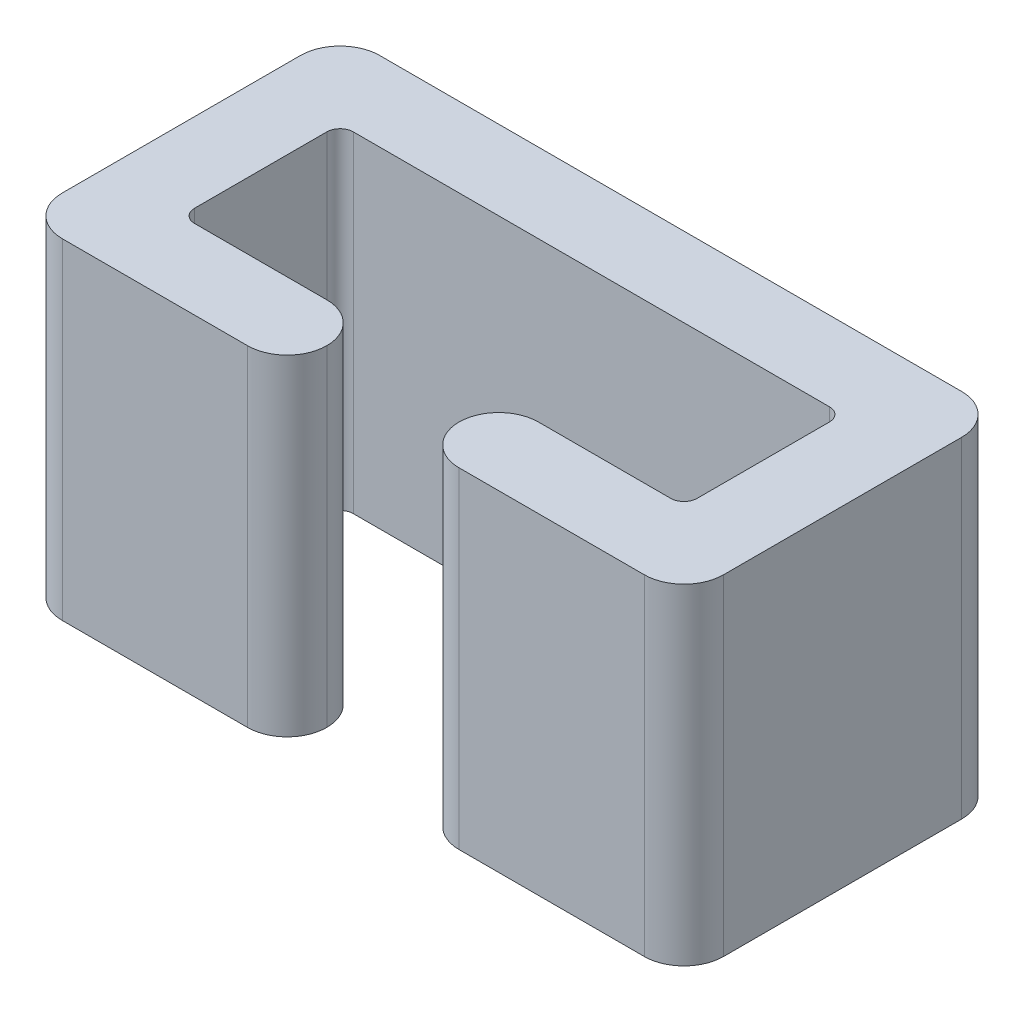
ISO-10303-21;
HEADER;
FILE_DESCRIPTION(('STEP AP214'),'2;1');
FILE_NAME('part.step','',(''),(''),'','','');
FILE_SCHEMA(('AUTOMOTIVE_DESIGN { 1 0 10303 214 1 1 1 1 }'));
ENDSEC;
DATA;
#1=APPLICATION_CONTEXT('core data for automotive mechanical design processes');
#2=APPLICATION_PROTOCOL_DEFINITION('international standard','automotive_design',2000,#1);
#3=PRODUCT_CONTEXT('',#1,'mechanical');
#4=PRODUCT('Part','Part','',(#3));
#5=PRODUCT_RELATED_PRODUCT_CATEGORY('part','',(#4));
#6=PRODUCT_DEFINITION_FORMATION('','',#4);
#7=PRODUCT_DEFINITION_CONTEXT('part definition',#1,'design');
#8=PRODUCT_DEFINITION('design','',#6,#7);
#9=PRODUCT_DEFINITION_SHAPE('','',#8);
#10=(LENGTH_UNIT() NAMED_UNIT(*) SI_UNIT(.MILLI.,.METRE.));
#11=(NAMED_UNIT(*) PLANE_ANGLE_UNIT() SI_UNIT($,.RADIAN.));
#12=(NAMED_UNIT(*) SI_UNIT($,.STERADIAN.) SOLID_ANGLE_UNIT());
#13=UNCERTAINTY_MEASURE_WITH_UNIT(LENGTH_MEASURE(1.E-05),#10,'distance_accuracy_value','');
#14=(GEOMETRIC_REPRESENTATION_CONTEXT(3) GLOBAL_UNCERTAINTY_ASSIGNED_CONTEXT((#13)) GLOBAL_UNIT_ASSIGNED_CONTEXT((#10,
#11,#12)) REPRESENTATION_CONTEXT('',''));
#15=CARTESIAN_POINT('',(0.,0.,0.));
#16=DIRECTION('',(0.,0.,1.));
#17=DIRECTION('',(1.,0.,0.));
#18=AXIS2_PLACEMENT_3D('',#15,#16,#17);
#19=CARTESIAN_POINT('',(1.,5.,4.8));
#20=DIRECTION('',(0.,0.,-1.));
#21=DIRECTION('',(-1.,0.,0.));
#22=AXIS2_PLACEMENT_3D('',#19,#20,#21);
#23=PLANE('',#22);
#24=DIRECTION('',(1.,0.,0.));
#25=VECTOR('',#24,1.);
#26=CARTESIAN_POINT('',(1.,0.,4.8));
#27=LINE('',#26,#25);
#28=CARTESIAN_POINT('',(1.6,0.,4.8));
#29=VERTEX_POINT('',#28);
#30=CARTESIAN_POINT('',(4.4,0.,4.8));
#31=VERTEX_POINT('',#30);
#32=EDGE_CURVE('E342',#29,#31,#27,.T.);
#33=ORIENTED_EDGE('',*,*,#32,.T.);
#34=DIRECTION('',(0.,-1.,0.));
#35=VECTOR('',#34,1.);
#36=CARTESIAN_POINT('',(4.4,5.,4.8));
#37=LINE('',#36,#35);
#38=CARTESIAN_POINT('',(4.4,5.,4.8));
#39=VERTEX_POINT('',#38);
#40=EDGE_CURVE('E319',#31,#39,#37,.F.);
#41=ORIENTED_EDGE('',*,*,#40,.T.);
#42=DIRECTION('',(1.,0.,0.));
#43=VECTOR('',#42,1.);
#44=CARTESIAN_POINT('',(1.,5.,4.8));
#45=LINE('',#44,#43);
#46=CARTESIAN_POINT('',(1.6,5.,4.8));
#47=VERTEX_POINT('',#46);
#48=EDGE_CURVE('E255',#47,#39,#45,.T.);
#49=ORIENTED_EDGE('',*,*,#48,.F.);
#50=DIRECTION('',(0.,-1.,0.));
#51=VECTOR('',#50,1.);
#52=CARTESIAN_POINT('',(1.6,5.,4.8));
#53=LINE('',#52,#51);
#54=EDGE_CURVE('E315',#47,#29,#53,.T.);
#55=ORIENTED_EDGE('',*,*,#54,.T.);
#56=EDGE_LOOP('',(#33,#41,#49,#55));
#57=FACE_BOUND('',#56,.T.);
#58=ADVANCED_FACE('F45',(#57),#23,.F.);
#59=CARTESIAN_POINT('',(5.,5.,4.8));
#60=DIRECTION('',(-1.,0.,0.));
#61=DIRECTION('',(0.,0.,1.));
#62=AXIS2_PLACEMENT_3D('',#59,#60,#61);
#63=PLANE('',#62);
#64=DIRECTION('',(0.,0.,-1.));
#65=VECTOR('',#64,1.);
#66=CARTESIAN_POINT('',(5.,0.,4.8));
#67=LINE('',#66,#65);
#68=CARTESIAN_POINT('',(5.,0.,4.2));
#69=VERTEX_POINT('',#68);
#70=CARTESIAN_POINT('',(5.,0.,0.6));
#71=VERTEX_POINT('',#70);
#72=EDGE_CURVE('E233',#69,#71,#67,.T.);
#73=ORIENTED_EDGE('',*,*,#72,.T.);
#74=DIRECTION('',(0.,-1.,0.));
#75=VECTOR('',#74,1.);
#76=CARTESIAN_POINT('',(5.,5.,0.6));
#77=LINE('',#76,#75);
#78=CARTESIAN_POINT('',(5.,5.,0.6));
#79=VERTEX_POINT('',#78);
#80=EDGE_CURVE('E312',#71,#79,#77,.F.);
#81=ORIENTED_EDGE('',*,*,#80,.T.);
#82=DIRECTION('',(0.,0.,-1.));
#83=VECTOR('',#82,1.);
#84=CARTESIAN_POINT('',(5.,5.,4.8));
#85=LINE('',#84,#83);
#86=CARTESIAN_POINT('',(5.,5.,4.2));
#87=VERTEX_POINT('',#86);
#88=EDGE_CURVE('E439',#87,#79,#85,.T.);
#89=ORIENTED_EDGE('',*,*,#88,.F.);
#90=DIRECTION('',(0.,-1.,0.));
#91=VECTOR('',#90,1.);
#92=CARTESIAN_POINT('',(5.,5.,4.2));
#93=LINE('',#92,#91);
#94=EDGE_CURVE('E308',#87,#69,#93,.T.);
#95=ORIENTED_EDGE('',*,*,#94,.T.);
#96=EDGE_LOOP('',(#73,#81,#89,#95));
#97=FACE_BOUND('',#96,.T.);
#98=ADVANCED_FACE('F429',(#97),#63,.F.);
#99=CARTESIAN_POINT('',(-5.,5.,0.));
#100=DIRECTION('',(0.,0.,1.));
#101=DIRECTION('',(1.,0.,0.));
#102=AXIS2_PLACEMENT_3D('',#99,#100,#101);
#103=PLANE('',#102);
#104=DIRECTION('',(-1.,0.,0.));
#105=VECTOR('',#104,1.);
#106=CARTESIAN_POINT('',(-5.,0.,0.));
#107=LINE('',#106,#105);
#108=CARTESIAN_POINT('',(4.4,0.,0.));
#109=VERTEX_POINT('',#108);
#110=CARTESIAN_POINT('',(-4.4,0.,0.));
#111=VERTEX_POINT('',#110);
#112=EDGE_CURVE('E226',#109,#111,#107,.T.);
#113=ORIENTED_EDGE('',*,*,#112,.T.);
#114=DIRECTION('',(0.,-1.,0.));
#115=VECTOR('',#114,1.);
#116=CARTESIAN_POINT('',(-4.4,5.,0.));
#117=LINE('',#116,#115);
#118=CARTESIAN_POINT('',(-4.4,5.,0.));
#119=VERTEX_POINT('',#118);
#120=EDGE_CURVE('E201',#111,#119,#117,.F.);
#121=ORIENTED_EDGE('',*,*,#120,.T.);
#122=DIRECTION('',(-1.,0.,0.));
#123=VECTOR('',#122,1.);
#124=CARTESIAN_POINT('',(-5.,5.,0.));
#125=LINE('',#124,#123);
#126=CARTESIAN_POINT('',(4.4,5.,0.));
#127=VERTEX_POINT('',#126);
#128=EDGE_CURVE('E438',#127,#119,#125,.T.);
#129=ORIENTED_EDGE('',*,*,#128,.F.);
#130=DIRECTION('',(0.,-1.,0.));
#131=VECTOR('',#130,1.);
#132=CARTESIAN_POINT('',(4.4,5.,0.));
#133=LINE('',#132,#131);
#134=EDGE_CURVE('E207',#127,#109,#133,.T.);
#135=ORIENTED_EDGE('',*,*,#134,.T.);
#136=EDGE_LOOP('',(#113,#121,#129,#135));
#137=FACE_BOUND('',#136,.T.);
#138=ADVANCED_FACE('F441',(#137),#103,.F.);
#139=CARTESIAN_POINT('',(-5.,5.,0.));
#140=DIRECTION('',(1.,0.,0.));
#141=DIRECTION('',(0.,0.,-1.));
#142=AXIS2_PLACEMENT_3D('',#139,#140,#141);
#143=PLANE('',#142);
#144=DIRECTION('',(0.,0.,1.));
#145=VECTOR('',#144,1.);
#146=CARTESIAN_POINT('',(-5.,5.,0.));
#147=LINE('',#146,#145);
#148=CARTESIAN_POINT('',(-5.,5.,0.6));
#149=VERTEX_POINT('',#148);
#150=CARTESIAN_POINT('',(-5.,5.,4.2));
#151=VERTEX_POINT('',#150);
#152=EDGE_CURVE('E217',#149,#151,#147,.T.);
#153=ORIENTED_EDGE('',*,*,#152,.F.);
#154=DIRECTION('',(0.,-1.,0.));
#155=VECTOR('',#154,1.);
#156=CARTESIAN_POINT('',(-5.,5.,0.6));
#157=LINE('',#156,#155);
#158=CARTESIAN_POINT('',(-5.,0.,0.6));
#159=VERTEX_POINT('',#158);
#160=EDGE_CURVE('E200',#149,#159,#157,.T.);
#161=ORIENTED_EDGE('',*,*,#160,.T.);
#162=DIRECTION('',(0.,0.,1.));
#163=VECTOR('',#162,1.);
#164=CARTESIAN_POINT('',(-5.,0.,0.));
#165=LINE('',#164,#163);
#166=CARTESIAN_POINT('',(-5.,0.,4.2));
#167=VERTEX_POINT('',#166);
#168=EDGE_CURVE('E214',#159,#167,#165,.T.);
#169=ORIENTED_EDGE('',*,*,#168,.T.);
#170=DIRECTION('',(0.,-1.,0.));
#171=VECTOR('',#170,1.);
#172=CARTESIAN_POINT('',(-5.,5.,4.2));
#173=LINE('',#172,#171);
#174=EDGE_CURVE('E220',#167,#151,#173,.F.);
#175=ORIENTED_EDGE('',*,*,#174,.T.);
#176=EDGE_LOOP('',(#153,#161,#169,#175));
#177=FACE_BOUND('',#176,.T.);
#178=ADVANCED_FACE('F213',(#177),#143,.F.);
#179=CARTESIAN_POINT('',(-5.,5.,4.8));
#180=DIRECTION('',(0.,0.,-1.));
#181=DIRECTION('',(-1.,0.,0.));
#182=AXIS2_PLACEMENT_3D('',#179,#180,#181);
#183=PLANE('',#182);
#184=DIRECTION('',(1.,0.,0.));
#185=VECTOR('',#184,1.);
#186=CARTESIAN_POINT('',(-5.,0.,4.8));
#187=LINE('',#186,#185);
#188=CARTESIAN_POINT('',(-4.4,0.,4.8));
#189=VERTEX_POINT('',#188);
#190=CARTESIAN_POINT('',(-1.6,0.,4.8));
#191=VERTEX_POINT('',#190);
#192=EDGE_CURVE('E225',#189,#191,#187,.T.);
#193=ORIENTED_EDGE('',*,*,#192,.T.);
#194=DIRECTION('',(0.,-1.,0.));
#195=VECTOR('',#194,1.);
#196=CARTESIAN_POINT('',(-1.6,5.,4.8));
#197=LINE('',#196,#195);
#198=CARTESIAN_POINT('',(-1.6,5.,4.8));
#199=VERTEX_POINT('',#198);
#200=EDGE_CURVE('E334',#191,#199,#197,.F.);
#201=ORIENTED_EDGE('',*,*,#200,.T.);
#202=DIRECTION('',(1.,0.,0.));
#203=VECTOR('',#202,1.);
#204=CARTESIAN_POINT('',(-5.,5.,4.8));
#205=LINE('',#204,#203);
#206=CARTESIAN_POINT('',(-4.4,5.,4.8));
#207=VERTEX_POINT('',#206);
#208=EDGE_CURVE('E446',#207,#199,#205,.T.);
#209=ORIENTED_EDGE('',*,*,#208,.F.);
#210=DIRECTION('',(0.,-1.,0.));
#211=VECTOR('',#210,1.);
#212=CARTESIAN_POINT('',(-4.4,5.,4.8));
#213=LINE('',#212,#211);
#214=EDGE_CURVE('E330',#207,#189,#213,.T.);
#215=ORIENTED_EDGE('',*,*,#214,.T.);
#216=EDGE_LOOP('',(#193,#201,#209,#215));
#217=FACE_BOUND('',#216,.T.);
#218=ADVANCED_FACE('F475',(#217),#183,.F.);
#219=CARTESIAN_POINT('',(-0.999999999999999,5.,3.6));
#220=DIRECTION('',(0.,0.,1.));
#221=DIRECTION('',(1.,0.,0.));
#222=AXIS2_PLACEMENT_3D('',#219,#220,#221);
#223=PLANE('',#222);
#224=DIRECTION('',(-1.,0.,0.));
#225=VECTOR('',#224,1.);
#226=CARTESIAN_POINT('',(-0.999999999999999,0.,3.6));
#227=LINE('',#226,#225);
#228=CARTESIAN_POINT('',(-1.6,0.,3.6));
#229=VERTEX_POINT('',#228);
#230=CARTESIAN_POINT('',(-3.6,0.,3.6));
#231=VERTEX_POINT('',#230);
#232=EDGE_CURVE('E231',#229,#231,#227,.T.);
#233=ORIENTED_EDGE('',*,*,#232,.T.);
#234=DIRECTION('',(0.,-1.,0.));
#235=VECTOR('',#234,1.);
#236=CARTESIAN_POINT('',(-3.6,5.,3.6));
#237=LINE('',#236,#235);
#238=CARTESIAN_POINT('',(-3.6,5.,3.6));
#239=VERTEX_POINT('',#238);
#240=EDGE_CURVE('E353',#231,#239,#237,.F.);
#241=ORIENTED_EDGE('',*,*,#240,.T.);
#242=DIRECTION('',(-1.,0.,0.));
#243=VECTOR('',#242,1.);
#244=CARTESIAN_POINT('',(-0.999999999999999,5.,3.6));
#245=LINE('',#244,#243);
#246=CARTESIAN_POINT('',(-1.6,5.,3.6));
#247=VERTEX_POINT('',#246);
#248=EDGE_CURVE('E416',#247,#239,#245,.T.);
#249=ORIENTED_EDGE('',*,*,#248,.F.);
#250=DIRECTION('',(0.,-1.,0.));
#251=VECTOR('',#250,1.);
#252=CARTESIAN_POINT('',(-1.6,5.,3.6));
#253=LINE('',#252,#251);
#254=EDGE_CURVE('E326',#247,#229,#253,.T.);
#255=ORIENTED_EDGE('',*,*,#254,.T.);
#256=EDGE_LOOP('',(#233,#241,#249,#255));
#257=FACE_BOUND('',#256,.T.);
#258=ADVANCED_FACE('F464',(#257),#223,.F.);
#259=CARTESIAN_POINT('',(-3.8,5.,3.6));
#260=DIRECTION('',(-1.,0.,0.));
#261=DIRECTION('',(0.,0.,1.));
#262=AXIS2_PLACEMENT_3D('',#259,#260,#261);
#263=PLANE('',#262);
#264=DIRECTION('',(0.,0.,-1.));
#265=VECTOR('',#264,1.);
#266=CARTESIAN_POINT('',(-3.8,5.,3.6));
#267=LINE('',#266,#265);
#268=CARTESIAN_POINT('',(-3.8,5.,3.4));
#269=VERTEX_POINT('',#268);
#270=CARTESIAN_POINT('',(-3.8,5.,1.4));
#271=VERTEX_POINT('',#270);
#272=EDGE_CURVE('E406',#269,#271,#267,.T.);
#273=ORIENTED_EDGE('',*,*,#272,.F.);
#274=DIRECTION('',(0.,-1.,0.));
#275=VECTOR('',#274,1.);
#276=CARTESIAN_POINT('',(-3.8,0.,3.4));
#277=LINE('',#276,#275);
#278=CARTESIAN_POINT('',(-3.8,0.,3.4));
#279=VERTEX_POINT('',#278);
#280=EDGE_CURVE('E349',#269,#279,#277,.T.);
#281=ORIENTED_EDGE('',*,*,#280,.T.);
#282=DIRECTION('',(0.,0.,-1.));
#283=VECTOR('',#282,1.);
#284=CARTESIAN_POINT('',(-3.8,0.,3.6));
#285=LINE('',#284,#283);
#286=CARTESIAN_POINT('',(-3.8,0.,1.4));
#287=VERTEX_POINT('',#286);
#288=EDGE_CURVE('E240',#279,#287,#285,.T.);
#289=ORIENTED_EDGE('',*,*,#288,.T.);
#290=DIRECTION('',(0.,-1.,0.));
#291=VECTOR('',#290,1.);
#292=CARTESIAN_POINT('',(-3.8,5.,1.4));
#293=LINE('',#292,#291);
#294=EDGE_CURVE('E337',#287,#271,#293,.F.);
#295=ORIENTED_EDGE('',*,*,#294,.T.);
#296=EDGE_LOOP('',(#273,#281,#289,#295));
#297=FACE_BOUND('',#296,.T.);
#298=ADVANCED_FACE('F396',(#297),#263,.F.);
#299=CARTESIAN_POINT('',(-3.8,5.,1.2));
#300=DIRECTION('',(0.,0.,-1.));
#301=DIRECTION('',(-1.,0.,0.));
#302=AXIS2_PLACEMENT_3D('',#299,#300,#301);
#303=PLANE('',#302);
#304=DIRECTION('',(1.,0.,0.));
#305=VECTOR('',#304,1.);
#306=CARTESIAN_POINT('',(-3.8,0.,1.2));
#307=LINE('',#306,#305);
#308=CARTESIAN_POINT('',(-3.6,0.,1.2));
#309=VERTEX_POINT('',#308);
#310=CARTESIAN_POINT('',(3.6,0.,1.2));
#311=VERTEX_POINT('',#310);
#312=EDGE_CURVE('E244',#309,#311,#307,.T.);
#313=ORIENTED_EDGE('',*,*,#312,.T.);
#314=DIRECTION('',(0.,-1.,0.));
#315=VECTOR('',#314,1.);
#316=CARTESIAN_POINT('',(3.6,5.,1.2));
#317=LINE('',#316,#315);
#318=CARTESIAN_POINT('',(3.6,5.,1.2));
#319=VERTEX_POINT('',#318);
#320=EDGE_CURVE('E367',#311,#319,#317,.F.);
#321=ORIENTED_EDGE('',*,*,#320,.T.);
#322=DIRECTION('',(1.,0.,0.));
#323=VECTOR('',#322,1.);
#324=CARTESIAN_POINT('',(-3.8,5.,1.2));
#325=LINE('',#324,#323);
#326=CARTESIAN_POINT('',(-3.6,5.,1.2));
#327=VERTEX_POINT('',#326);
#328=EDGE_CURVE('E404',#327,#319,#325,.T.);
#329=ORIENTED_EDGE('',*,*,#328,.F.);
#330=DIRECTION('',(0.,-1.,0.));
#331=VECTOR('',#330,1.);
#332=CARTESIAN_POINT('',(-3.6,0.,1.2));
#333=LINE('',#332,#331);
#334=EDGE_CURVE('E363',#327,#309,#333,.T.);
#335=ORIENTED_EDGE('',*,*,#334,.T.);
#336=EDGE_LOOP('',(#313,#321,#329,#335));
#337=FACE_BOUND('',#336,.T.);
#338=ADVANCED_FACE('F408',(#337),#303,.F.);
#339=CARTESIAN_POINT('',(3.8,5.,1.2));
#340=DIRECTION('',(1.,0.,0.));
#341=DIRECTION('',(0.,0.,-1.));
#342=AXIS2_PLACEMENT_3D('',#339,#340,#341);
#343=PLANE('',#342);
#344=DIRECTION('',(0.,0.,1.));
#345=VECTOR('',#344,1.);
#346=CARTESIAN_POINT('',(3.8,5.,1.2));
#347=LINE('',#346,#345);
#348=CARTESIAN_POINT('',(3.8,5.,1.4));
#349=VERTEX_POINT('',#348);
#350=CARTESIAN_POINT('',(3.8,5.,3.4));
#351=VERTEX_POINT('',#350);
#352=EDGE_CURVE('E411',#349,#351,#347,.T.);
#353=ORIENTED_EDGE('',*,*,#352,.F.);
#354=DIRECTION('',(0.,-1.,0.));
#355=VECTOR('',#354,1.);
#356=CARTESIAN_POINT('',(3.8,0.,1.4));
#357=LINE('',#356,#355);
#358=CARTESIAN_POINT('',(3.8,0.,1.4));
#359=VERTEX_POINT('',#358);
#360=EDGE_CURVE('E359',#349,#359,#357,.T.);
#361=ORIENTED_EDGE('',*,*,#360,.T.);
#362=DIRECTION('',(0.,0.,1.));
#363=VECTOR('',#362,1.);
#364=CARTESIAN_POINT('',(3.8,0.,1.2));
#365=LINE('',#364,#363);
#366=CARTESIAN_POINT('',(3.8,0.,3.4));
#367=VERTEX_POINT('',#366);
#368=EDGE_CURVE('E248',#359,#367,#365,.T.);
#369=ORIENTED_EDGE('',*,*,#368,.T.);
#370=DIRECTION('',(0.,-1.,0.));
#371=VECTOR('',#370,1.);
#372=CARTESIAN_POINT('',(3.8,5.,3.4));
#373=LINE('',#372,#371);
#374=EDGE_CURVE('E356',#367,#351,#373,.F.);
#375=ORIENTED_EDGE('',*,*,#374,.T.);
#376=EDGE_LOOP('',(#353,#361,#369,#375));
#377=FACE_BOUND('',#376,.T.);
#378=ADVANCED_FACE('F582',(#377),#343,.F.);
#379=CARTESIAN_POINT('',(3.8,5.,3.6));
#380=DIRECTION('',(0.,0.,1.));
#381=DIRECTION('',(1.,0.,0.));
#382=AXIS2_PLACEMENT_3D('',#379,#380,#381);
#383=PLANE('',#382);
#384=DIRECTION('',(-1.,0.,0.));
#385=VECTOR('',#384,1.);
#386=CARTESIAN_POINT('',(3.8,5.,3.6));
#387=LINE('',#386,#385);
#388=CARTESIAN_POINT('',(3.6,5.,3.6));
#389=VERTEX_POINT('',#388);
#390=CARTESIAN_POINT('',(1.6,5.,3.6));
#391=VERTEX_POINT('',#390);
#392=EDGE_CURVE('E257',#389,#391,#387,.T.);
#393=ORIENTED_EDGE('',*,*,#392,.F.);
#394=DIRECTION('',(0.,-1.,0.));
#395=VECTOR('',#394,1.);
#396=CARTESIAN_POINT('',(3.6,0.,3.6));
#397=LINE('',#396,#395);
#398=CARTESIAN_POINT('',(3.6,0.,3.6));
#399=VERTEX_POINT('',#398);
#400=EDGE_CURVE('E370',#389,#399,#397,.T.);
#401=ORIENTED_EDGE('',*,*,#400,.T.);
#402=DIRECTION('',(-1.,0.,0.));
#403=VECTOR('',#402,1.);
#404=CARTESIAN_POINT('',(3.8,0.,3.6));
#405=LINE('',#404,#403);
#406=CARTESIAN_POINT('',(1.6,0.,3.6));
#407=VERTEX_POINT('',#406);
#408=EDGE_CURVE('E252',#399,#407,#405,.T.);
#409=ORIENTED_EDGE('',*,*,#408,.T.);
#410=DIRECTION('',(0.,-1.,0.));
#411=VECTOR('',#410,1.);
#412=CARTESIAN_POINT('',(1.6,5.,3.6));
#413=LINE('',#412,#411);
#414=EDGE_CURVE('E322',#407,#391,#413,.F.);
#415=ORIENTED_EDGE('',*,*,#414,.T.);
#416=EDGE_LOOP('',(#393,#401,#409,#415));
#417=FACE_BOUND('',#416,.T.);
#418=ADVANCED_FACE('F566',(#417),#383,.F.);
#419=CARTESIAN_POINT('',(0.,5.,0.));
#420=DIRECTION('',(0.,1.,0.));
#421=DIRECTION('',(0.,0.,1.));
#422=AXIS2_PLACEMENT_3D('',#419,#420,#421);
#423=PLANE('',#422);
#424=ORIENTED_EDGE('',*,*,#128,.T.);
#425=CARTESIAN_POINT('',(-4.4,5.,0.6));
#426=DIRECTION('',(0.,1.,0.));
#427=DIRECTION('',(0.,0.,1.));
#428=AXIS2_PLACEMENT_3D('',#425,#426,#427);
#429=CIRCLE('',#428,0.6);
#430=EDGE_CURVE('E305',#119,#149,#429,.T.);
#431=ORIENTED_EDGE('',*,*,#430,.T.);
#432=ORIENTED_EDGE('',*,*,#152,.T.);
#433=CARTESIAN_POINT('',(-4.4,5.,4.2));
#434=DIRECTION('',(0.,1.,0.));
#435=DIRECTION('',(0.,0.,1.));
#436=AXIS2_PLACEMENT_3D('',#433,#434,#435);
#437=CIRCLE('',#436,0.6);
#438=EDGE_CURVE('E284',#151,#207,#437,.T.);
#439=ORIENTED_EDGE('',*,*,#438,.T.);
#440=ORIENTED_EDGE('',*,*,#208,.T.);
#441=CARTESIAN_POINT('',(-1.6,5.,4.2));
#442=DIRECTION('',(0.,1.,0.));
#443=DIRECTION('',(0.,0.,1.));
#444=AXIS2_PLACEMENT_3D('',#441,#442,#443);
#445=CIRCLE('',#444,0.6);
#446=CARTESIAN_POINT('',(-0.999999999999999,5.,4.2));
#447=VERTEX_POINT('',#446);
#448=EDGE_CURVE('E287',#199,#447,#445,.T.);
#449=ORIENTED_EDGE('',*,*,#448,.T.);
#450=CARTESIAN_POINT('',(-1.6,5.,4.2));
#451=DIRECTION('',(0.,1.,0.));
#452=DIRECTION('',(0.,0.,1.));
#453=AXIS2_PLACEMENT_3D('',#450,#451,#452);
#454=CIRCLE('',#453,0.6);
#455=EDGE_CURVE('E290',#447,#247,#454,.T.);
#456=ORIENTED_EDGE('',*,*,#455,.T.);
#457=ORIENTED_EDGE('',*,*,#248,.T.);
#458=CARTESIAN_POINT('',(-3.6,5.,3.4));
#459=DIRECTION('',(0.,1.,0.));
#460=DIRECTION('',(0.,0.,1.));
#461=AXIS2_PLACEMENT_3D('',#458,#459,#460);
#462=CIRCLE('',#461,0.2);
#463=EDGE_CURVE('E376',#239,#269,#462,.F.);
#464=ORIENTED_EDGE('',*,*,#463,.T.);
#465=ORIENTED_EDGE('',*,*,#272,.T.);
#466=CARTESIAN_POINT('',(-3.6,5.,1.4));
#467=DIRECTION('',(0.,1.,0.));
#468=DIRECTION('',(0.,0.,1.));
#469=AXIS2_PLACEMENT_3D('',#466,#467,#468);
#470=CIRCLE('',#469,0.2);
#471=EDGE_CURVE('E11',#271,#327,#470,.F.);
#472=ORIENTED_EDGE('',*,*,#471,.T.);
#473=ORIENTED_EDGE('',*,*,#328,.T.);
#474=CARTESIAN_POINT('',(3.6,5.,1.4));
#475=DIRECTION('',(0.,1.,0.));
#476=DIRECTION('',(0.,0.,1.));
#477=AXIS2_PLACEMENT_3D('',#474,#475,#476);
#478=CIRCLE('',#477,0.2);
#479=EDGE_CURVE('E382',#319,#349,#478,.F.);
#480=ORIENTED_EDGE('',*,*,#479,.T.);
#481=ORIENTED_EDGE('',*,*,#352,.T.);
#482=CARTESIAN_POINT('',(3.6,5.,3.4));
#483=DIRECTION('',(0.,1.,0.));
#484=DIRECTION('',(0.,0.,1.));
#485=AXIS2_PLACEMENT_3D('',#482,#483,#484);
#486=CIRCLE('',#485,0.2);
#487=EDGE_CURVE('E61',#351,#389,#486,.F.);
#488=ORIENTED_EDGE('',*,*,#487,.T.);
#489=ORIENTED_EDGE('',*,*,#392,.T.);
#490=CARTESIAN_POINT('',(1.6,5.,4.2));
#491=DIRECTION('',(0.,1.,0.));
#492=DIRECTION('',(0.,0.,1.));
#493=AXIS2_PLACEMENT_3D('',#490,#491,#492);
#494=CIRCLE('',#493,0.6);
#495=CARTESIAN_POINT('',(1.,5.,4.2));
#496=VERTEX_POINT('',#495);
#497=EDGE_CURVE('E293',#391,#496,#494,.T.);
#498=ORIENTED_EDGE('',*,*,#497,.T.);
#499=CARTESIAN_POINT('',(1.6,5.,4.2));
#500=DIRECTION('',(0.,1.,0.));
#501=DIRECTION('',(0.,0.,1.));
#502=AXIS2_PLACEMENT_3D('',#499,#500,#501);
#503=CIRCLE('',#502,0.6);
#504=EDGE_CURVE('E296',#496,#47,#503,.T.);
#505=ORIENTED_EDGE('',*,*,#504,.T.);
#506=ORIENTED_EDGE('',*,*,#48,.T.);
#507=CARTESIAN_POINT('',(4.4,5.,4.2));
#508=DIRECTION('',(0.,1.,0.));
#509=DIRECTION('',(0.,0.,1.));
#510=AXIS2_PLACEMENT_3D('',#507,#508,#509);
#511=CIRCLE('',#510,0.6);
#512=EDGE_CURVE('E299',#39,#87,#511,.T.);
#513=ORIENTED_EDGE('',*,*,#512,.T.);
#514=ORIENTED_EDGE('',*,*,#88,.T.);
#515=CARTESIAN_POINT('',(4.4,5.,0.6));
#516=DIRECTION('',(0.,1.,0.));
#517=DIRECTION('',(0.,0.,1.));
#518=AXIS2_PLACEMENT_3D('',#515,#516,#517);
#519=CIRCLE('',#518,0.6);
#520=EDGE_CURVE('E302',#79,#127,#519,.T.);
#521=ORIENTED_EDGE('',*,*,#520,.T.);
#522=EDGE_LOOP('',(#424,#431,#432,#439,#440,#449,#456,#457,#464,#465,#472,#473,#480,#481,#488,
#489,#498,#505,#506,#513,#514,#521));
#523=FACE_BOUND('',#522,.T.);
#524=ADVANCED_FACE('F403',(#523),#423,.T.);
#525=CARTESIAN_POINT('',(0.,0.,0.));
#526=DIRECTION('',(0.,1.,0.));
#527=DIRECTION('',(0.,0.,1.));
#528=AXIS2_PLACEMENT_3D('',#525,#526,#527);
#529=PLANE('',#528);
#530=ORIENTED_EDGE('',*,*,#168,.F.);
#531=CARTESIAN_POINT('',(-4.4,0.,0.6));
#532=DIRECTION('',(0.,1.,0.));
#533=DIRECTION('',(0.,0.,1.));
#534=AXIS2_PLACEMENT_3D('',#531,#532,#533);
#535=CIRCLE('',#534,0.6);
#536=EDGE_CURVE('E196',#159,#111,#535,.F.);
#537=ORIENTED_EDGE('',*,*,#536,.T.);
#538=ORIENTED_EDGE('',*,*,#112,.F.);
#539=CARTESIAN_POINT('',(4.4,0.,0.6));
#540=DIRECTION('',(0.,1.,0.));
#541=DIRECTION('',(0.,0.,1.));
#542=AXIS2_PLACEMENT_3D('',#539,#540,#541);
#543=CIRCLE('',#542,0.6);
#544=EDGE_CURVE('E208',#109,#71,#543,.F.);
#545=ORIENTED_EDGE('',*,*,#544,.T.);
#546=ORIENTED_EDGE('',*,*,#72,.F.);
#547=CARTESIAN_POINT('',(4.4,0.,4.2));
#548=DIRECTION('',(0.,1.,0.));
#549=DIRECTION('',(0.,0.,1.));
#550=AXIS2_PLACEMENT_3D('',#547,#548,#549);
#551=CIRCLE('',#550,0.6);
#552=EDGE_CURVE('E274',#69,#31,#551,.F.);
#553=ORIENTED_EDGE('',*,*,#552,.T.);
#554=ORIENTED_EDGE('',*,*,#32,.F.);
#555=CARTESIAN_POINT('',(1.6,0.,4.2));
#556=DIRECTION('',(0.,1.,0.));
#557=DIRECTION('',(0.,0.,1.));
#558=AXIS2_PLACEMENT_3D('',#555,#556,#557);
#559=CIRCLE('',#558,0.6);
#560=CARTESIAN_POINT('',(1.,0.,4.2));
#561=VERTEX_POINT('',#560);
#562=EDGE_CURVE('E271',#29,#561,#559,.F.);
#563=ORIENTED_EDGE('',*,*,#562,.T.);
#564=CARTESIAN_POINT('',(1.6,0.,4.2));
#565=DIRECTION('',(0.,1.,0.));
#566=DIRECTION('',(0.,0.,1.));
#567=AXIS2_PLACEMENT_3D('',#564,#565,#566);
#568=CIRCLE('',#567,0.6);
#569=EDGE_CURVE('E267',#561,#407,#568,.F.);
#570=ORIENTED_EDGE('',*,*,#569,.T.);
#571=ORIENTED_EDGE('',*,*,#408,.F.);
#572=CARTESIAN_POINT('',(3.6,0.,3.4));
#573=DIRECTION('',(0.,1.,0.));
#574=DIRECTION('',(0.,0.,1.));
#575=AXIS2_PLACEMENT_3D('',#572,#573,#574);
#576=CIRCLE('',#575,0.2);
#577=EDGE_CURVE('E69',#399,#367,#576,.T.);
#578=ORIENTED_EDGE('',*,*,#577,.T.);
#579=ORIENTED_EDGE('',*,*,#368,.F.);
#580=CARTESIAN_POINT('',(3.6,0.,1.4));
#581=DIRECTION('',(0.,1.,0.));
#582=DIRECTION('',(0.,0.,1.));
#583=AXIS2_PLACEMENT_3D('',#580,#581,#582);
#584=CIRCLE('',#583,0.2);
#585=EDGE_CURVE('E379',#359,#311,#584,.T.);
#586=ORIENTED_EDGE('',*,*,#585,.T.);
#587=ORIENTED_EDGE('',*,*,#312,.F.);
#588=CARTESIAN_POINT('',(-3.6,0.,1.4));
#589=DIRECTION('',(0.,1.,0.));
#590=DIRECTION('',(0.,0.,1.));
#591=AXIS2_PLACEMENT_3D('',#588,#589,#590);
#592=CIRCLE('',#591,0.2);
#593=EDGE_CURVE('E54',#309,#287,#592,.T.);
#594=ORIENTED_EDGE('',*,*,#593,.T.);
#595=ORIENTED_EDGE('',*,*,#288,.F.);
#596=CARTESIAN_POINT('',(-3.6,0.,3.4));
#597=DIRECTION('',(0.,1.,0.));
#598=DIRECTION('',(0.,0.,1.));
#599=AXIS2_PLACEMENT_3D('',#596,#597,#598);
#600=CIRCLE('',#599,0.2);
#601=EDGE_CURVE('E373',#279,#231,#600,.T.);
#602=ORIENTED_EDGE('',*,*,#601,.T.);
#603=ORIENTED_EDGE('',*,*,#232,.F.);
#604=CARTESIAN_POINT('',(-1.6,0.,4.2));
#605=DIRECTION('',(0.,1.,0.));
#606=DIRECTION('',(0.,0.,1.));
#607=AXIS2_PLACEMENT_3D('',#604,#605,#606);
#608=CIRCLE('',#607,0.6);
#609=CARTESIAN_POINT('',(-0.999999999999999,0.,4.2));
#610=VERTEX_POINT('',#609);
#611=EDGE_CURVE('E264',#229,#610,#608,.F.);
#612=ORIENTED_EDGE('',*,*,#611,.T.);
#613=CARTESIAN_POINT('',(-1.6,0.,4.2));
#614=DIRECTION('',(0.,1.,0.));
#615=DIRECTION('',(0.,0.,1.));
#616=AXIS2_PLACEMENT_3D('',#613,#614,#615);
#617=CIRCLE('',#616,0.6);
#618=EDGE_CURVE('E261',#610,#191,#617,.F.);
#619=ORIENTED_EDGE('',*,*,#618,.T.);
#620=ORIENTED_EDGE('',*,*,#192,.F.);
#621=CARTESIAN_POINT('',(-4.4,0.,4.2));
#622=DIRECTION('',(0.,1.,0.));
#623=DIRECTION('',(0.,0.,1.));
#624=AXIS2_PLACEMENT_3D('',#621,#622,#623);
#625=CIRCLE('',#624,0.6);
#626=EDGE_CURVE('E219',#189,#167,#625,.F.);
#627=ORIENTED_EDGE('',*,*,#626,.T.);
#628=EDGE_LOOP('',(#530,#537,#538,#545,#546,#553,#554,#563,#570,#571,#578,#579,#586,#587,#594,
#595,#602,#603,#612,#619,#620,#627));
#629=FACE_BOUND('',#628,.T.);
#630=ADVANCED_FACE('F222',(#629),#529,.F.);
#631=CARTESIAN_POINT('',(-4.4,5.,0.6));
#632=DIRECTION('',(0.,-1.,0.));
#633=DIRECTION('',(0.,0.,-1.));
#634=AXIS2_PLACEMENT_3D('',#631,#632,#633);
#635=CYLINDRICAL_SURFACE('',#634,0.6);
#636=ORIENTED_EDGE('',*,*,#430,.F.);
#637=ORIENTED_EDGE('',*,*,#120,.F.);
#638=ORIENTED_EDGE('',*,*,#536,.F.);
#639=ORIENTED_EDGE('',*,*,#160,.F.);
#640=EDGE_LOOP('',(#636,#637,#638,#639));
#641=FACE_BOUND('',#640,.T.);
#642=ADVANCED_FACE('F199',(#641),#635,.T.);
#643=CARTESIAN_POINT('',(4.4,5.,0.6));
#644=DIRECTION('',(0.,-1.,0.));
#645=DIRECTION('',(0.,0.,-1.));
#646=AXIS2_PLACEMENT_3D('',#643,#644,#645);
#647=CYLINDRICAL_SURFACE('',#646,0.6);
#648=ORIENTED_EDGE('',*,*,#520,.F.);
#649=ORIENTED_EDGE('',*,*,#80,.F.);
#650=ORIENTED_EDGE('',*,*,#544,.F.);
#651=ORIENTED_EDGE('',*,*,#134,.F.);
#652=EDGE_LOOP('',(#648,#649,#650,#651));
#653=FACE_BOUND('',#652,.T.);
#654=ADVANCED_FACE('F435',(#653),#647,.T.);
#655=CARTESIAN_POINT('',(4.4,5.,4.2));
#656=DIRECTION('',(0.,-1.,0.));
#657=DIRECTION('',(0.,0.,-1.));
#658=AXIS2_PLACEMENT_3D('',#655,#656,#657);
#659=CYLINDRICAL_SURFACE('',#658,0.6);
#660=ORIENTED_EDGE('',*,*,#512,.F.);
#661=ORIENTED_EDGE('',*,*,#40,.F.);
#662=ORIENTED_EDGE('',*,*,#552,.F.);
#663=ORIENTED_EDGE('',*,*,#94,.F.);
#664=EDGE_LOOP('',(#660,#661,#662,#663));
#665=FACE_BOUND('',#664,.T.);
#666=ADVANCED_FACE('F504',(#665),#659,.T.);
#667=CARTESIAN_POINT('',(1.6,5.,4.2));
#668=DIRECTION('',(0.,-1.,0.));
#669=DIRECTION('',(0.,0.,-1.));
#670=AXIS2_PLACEMENT_3D('',#667,#668,#669);
#671=CYLINDRICAL_SURFACE('',#670,0.6);
#672=DIRECTION('',(0.,-1.,0.));
#673=VECTOR('',#672,1.);
#674=CARTESIAN_POINT('',(1.,5.,4.2));
#675=LINE('',#674,#673);
#676=EDGE_CURVE('E338',#496,#561,#675,.T.);
#677=ORIENTED_EDGE('',*,*,#676,.F.);
#678=ORIENTED_EDGE('',*,*,#497,.F.);
#679=ORIENTED_EDGE('',*,*,#414,.F.);
#680=ORIENTED_EDGE('',*,*,#569,.F.);
#681=EDGE_LOOP('',(#677,#678,#679,#680));
#682=FACE_BOUND('',#681,.T.);
#683=ADVANCED_FACE('F507',(#682),#671,.T.);
#684=CARTESIAN_POINT('',(1.6,5.,4.2));
#685=DIRECTION('',(0.,-1.,0.));
#686=DIRECTION('',(0.,0.,-1.));
#687=AXIS2_PLACEMENT_3D('',#684,#685,#686);
#688=CYLINDRICAL_SURFACE('',#687,0.6);
#689=ORIENTED_EDGE('',*,*,#504,.F.);
#690=ORIENTED_EDGE('',*,*,#676,.T.);
#691=ORIENTED_EDGE('',*,*,#562,.F.);
#692=ORIENTED_EDGE('',*,*,#54,.F.);
#693=EDGE_LOOP('',(#689,#690,#691,#692));
#694=FACE_BOUND('',#693,.T.);
#695=ADVANCED_FACE('F509',(#694),#688,.T.);
#696=CARTESIAN_POINT('',(-1.6,5.,4.2));
#697=DIRECTION('',(0.,-1.,0.));
#698=DIRECTION('',(0.,0.,-1.));
#699=AXIS2_PLACEMENT_3D('',#696,#697,#698);
#700=CYLINDRICAL_SURFACE('',#699,0.6);
#701=DIRECTION('',(0.,-1.,0.));
#702=VECTOR('',#701,1.);
#703=CARTESIAN_POINT('',(-0.999999999999999,5.,4.2));
#704=LINE('',#703,#702);
#705=EDGE_CURVE('E343',#447,#610,#704,.T.);
#706=ORIENTED_EDGE('',*,*,#705,.F.);
#707=ORIENTED_EDGE('',*,*,#448,.F.);
#708=ORIENTED_EDGE('',*,*,#200,.F.);
#709=ORIENTED_EDGE('',*,*,#618,.F.);
#710=EDGE_LOOP('',(#706,#707,#708,#709));
#711=FACE_BOUND('',#710,.T.);
#712=ADVANCED_FACE('F471',(#711),#700,.T.);
#713=CARTESIAN_POINT('',(-1.6,5.,4.2));
#714=DIRECTION('',(0.,-1.,0.));
#715=DIRECTION('',(0.,0.,-1.));
#716=AXIS2_PLACEMENT_3D('',#713,#714,#715);
#717=CYLINDRICAL_SURFACE('',#716,0.6);
#718=ORIENTED_EDGE('',*,*,#455,.F.);
#719=ORIENTED_EDGE('',*,*,#705,.T.);
#720=ORIENTED_EDGE('',*,*,#611,.F.);
#721=ORIENTED_EDGE('',*,*,#254,.F.);
#722=EDGE_LOOP('',(#718,#719,#720,#721));
#723=FACE_BOUND('',#722,.T.);
#724=ADVANCED_FACE('F466',(#723),#717,.T.);
#725=CARTESIAN_POINT('',(-4.4,5.,4.2));
#726=DIRECTION('',(0.,-1.,0.));
#727=DIRECTION('',(0.,0.,-1.));
#728=AXIS2_PLACEMENT_3D('',#725,#726,#727);
#729=CYLINDRICAL_SURFACE('',#728,0.6);
#730=ORIENTED_EDGE('',*,*,#438,.F.);
#731=ORIENTED_EDGE('',*,*,#174,.F.);
#732=ORIENTED_EDGE('',*,*,#626,.F.);
#733=ORIENTED_EDGE('',*,*,#214,.F.);
#734=EDGE_LOOP('',(#730,#731,#732,#733));
#735=FACE_BOUND('',#734,.T.);
#736=ADVANCED_FACE('F479',(#735),#729,.T.);
#737=CARTESIAN_POINT('',(-3.6,5.,3.4));
#738=DIRECTION('',(0.,1.,0.));
#739=DIRECTION('',(0.,0.,1.));
#740=AXIS2_PLACEMENT_3D('',#737,#738,#739);
#741=CYLINDRICAL_SURFACE('',#740,0.2);
#742=ORIENTED_EDGE('',*,*,#463,.F.);
#743=ORIENTED_EDGE('',*,*,#240,.F.);
#744=ORIENTED_EDGE('',*,*,#601,.F.);
#745=ORIENTED_EDGE('',*,*,#280,.F.);
#746=EDGE_LOOP('',(#742,#743,#744,#745));
#747=FACE_BOUND('',#746,.T.);
#748=ADVANCED_FACE('F462',(#747),#741,.F.);
#749=CARTESIAN_POINT('',(3.6,5.,1.4));
#750=DIRECTION('',(0.,1.,0.));
#751=DIRECTION('',(0.,0.,1.));
#752=AXIS2_PLACEMENT_3D('',#749,#750,#751);
#753=CYLINDRICAL_SURFACE('',#752,0.2);
#754=ORIENTED_EDGE('',*,*,#479,.F.);
#755=ORIENTED_EDGE('',*,*,#320,.F.);
#756=ORIENTED_EDGE('',*,*,#585,.F.);
#757=ORIENTED_EDGE('',*,*,#360,.F.);
#758=EDGE_LOOP('',(#754,#755,#756,#757));
#759=FACE_BOUND('',#758,.T.);
#760=ADVANCED_FACE('F487',(#759),#753,.F.);
#761=CARTESIAN_POINT('',(3.6,5.,3.4));
#762=DIRECTION('',(0.,1.,0.));
#763=DIRECTION('',(0.,0.,1.));
#764=AXIS2_PLACEMENT_3D('',#761,#762,#763);
#765=CYLINDRICAL_SURFACE('',#764,0.2);
#766=ORIENTED_EDGE('',*,*,#487,.F.);
#767=ORIENTED_EDGE('',*,*,#374,.F.);
#768=ORIENTED_EDGE('',*,*,#577,.F.);
#769=ORIENTED_EDGE('',*,*,#400,.F.);
#770=EDGE_LOOP('',(#766,#767,#768,#769));
#771=FACE_BOUND('',#770,.T.);
#772=ADVANCED_FACE('F546',(#771),#765,.F.);
#773=CARTESIAN_POINT('',(-3.6,5.,1.4));
#774=DIRECTION('',(0.,1.,0.));
#775=DIRECTION('',(0.,0.,1.));
#776=AXIS2_PLACEMENT_3D('',#773,#774,#775);
#777=CYLINDRICAL_SURFACE('',#776,0.2);
#778=ORIENTED_EDGE('',*,*,#471,.F.);
#779=ORIENTED_EDGE('',*,*,#294,.F.);
#780=ORIENTED_EDGE('',*,*,#593,.F.);
#781=ORIENTED_EDGE('',*,*,#334,.F.);
#782=EDGE_LOOP('',(#778,#779,#780,#781));
#783=FACE_BOUND('',#782,.T.);
#784=ADVANCED_FACE('F47',(#783),#777,.F.);
#785=CLOSED_SHELL('',(#58,#98,#138,#178,#218,#258,#298,#338,#378,#418,#524,#630,#642,#654,#666,
#683,#695,#712,#724,#736,#748,#760,#772,#784));
#786=MANIFOLD_SOLID_BREP('B2',#785);
#787=ADVANCED_BREP_SHAPE_REPRESENTATION('',(#18,#786),#14);
#788=SHAPE_DEFINITION_REPRESENTATION(#9,#787);
ENDSEC;
END-ISO-10303-21;
